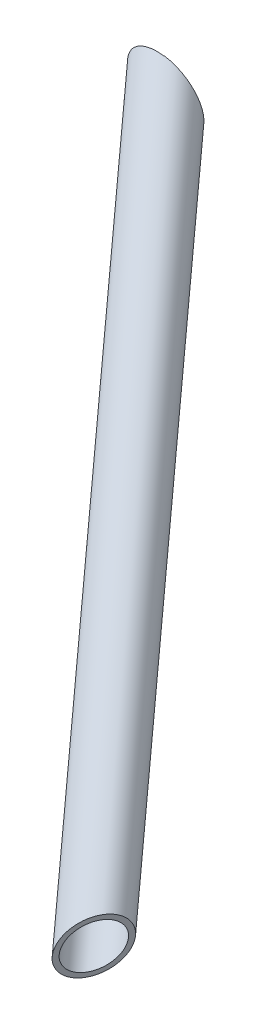
ISO-10303-21;
HEADER;
FILE_DESCRIPTION(('STEP AP214'),'2;1');
FILE_NAME('part.step','',(''),(''),'','','');
FILE_SCHEMA(('AUTOMOTIVE_DESIGN { 1 0 10303 214 1 1 1 1 }'));
ENDSEC;
DATA;
#1=APPLICATION_CONTEXT('core data for automotive mechanical design processes');
#2=APPLICATION_PROTOCOL_DEFINITION('international standard','automotive_design',2000,#1);
#3=PRODUCT_CONTEXT('',#1,'mechanical');
#4=PRODUCT('Part','Part','',(#3));
#5=PRODUCT_RELATED_PRODUCT_CATEGORY('part','',(#4));
#6=PRODUCT_DEFINITION_FORMATION('','',#4);
#7=PRODUCT_DEFINITION_CONTEXT('part definition',#1,'design');
#8=PRODUCT_DEFINITION('design','',#6,#7);
#9=PRODUCT_DEFINITION_SHAPE('','',#8);
#10=(LENGTH_UNIT() NAMED_UNIT(*) SI_UNIT(.MILLI.,.METRE.));
#11=(NAMED_UNIT(*) PLANE_ANGLE_UNIT() SI_UNIT($,.RADIAN.));
#12=(NAMED_UNIT(*) SI_UNIT($,.STERADIAN.) SOLID_ANGLE_UNIT());
#13=UNCERTAINTY_MEASURE_WITH_UNIT(LENGTH_MEASURE(1.E-05),#10,'distance_accuracy_value','');
#14=(GEOMETRIC_REPRESENTATION_CONTEXT(3) GLOBAL_UNCERTAINTY_ASSIGNED_CONTEXT((#13)) GLOBAL_UNIT_ASSIGNED_CONTEXT((#10,
#11,#12)) REPRESENTATION_CONTEXT('',''));
#15=CARTESIAN_POINT('',(0.,0.,0.));
#16=DIRECTION('',(0.,0.,1.));
#17=DIRECTION('',(1.,0.,0.));
#18=AXIS2_PLACEMENT_3D('',#15,#16,#17);
#19=CARTESIAN_POINT('',(-225.,200.,-200.));
#20=DIRECTION('',(0.636784790371592,-0.254713916148637,0.727754046138963));
#21=DIRECTION('',(0.752576694706878,0.,-0.658504607868518));
#22=AXIS2_PLACEMENT_3D('',#19,#20,#21);
#23=CYLINDRICAL_SURFACE('',#22,7.9);
#24=CARTESIAN_POINT('',(-212.607403081643,195.042961232657,-185.837032093306));
#25=DIRECTION('',(-0.936285084522112,-0.351106906695792,-0.00970466753338269));
#26=DIRECTION('',(0.181471265379071,-0.507210243684345,0.842499821093979));
#27=AXIS2_PLACEMENT_3D('',#24,#25,#26);
#28=ELLIPSE('',#27,15.3743489378713,7.9);
#29=CARTESIAN_POINT('',(-216.16230767722,204.63510274096,-189.903424238614));
#30=VERTEX_POINT('',#29);
#31=CARTESIAN_POINT('',(-216.168817710753,204.655132204404,-190.));
#32=VERTEX_POINT('',#31);
#33=EDGE_CURVE('E140',#30,#32,#28,.T.);
#34=ORIENTED_EDGE('',*,*,#33,.T.);
#35=CARTESIAN_POINT('',(-216.25,196.5,-190.));
#36=DIRECTION('',(0.,0.,-1.));
#37=DIRECTION('',(0.928476690885259,-0.371390676354104,0.));
#38=AXIS2_PLACEMENT_3D('',#35,#36,#37);
#39=ELLIPSE('',#38,10.8553158060924,7.9);
#40=CARTESIAN_POINT('',(-208.021674420814,190.,-190.));
#41=VERTEX_POINT('',#40);
#42=EDGE_CURVE('E137',#32,#41,#39,.T.);
#43=ORIENTED_EDGE('',*,*,#42,.T.);
#44=CARTESIAN_POINT('',(-200.,190.,-171.428571428571));
#45=DIRECTION('',(0.,1.,0.));
#46=DIRECTION('',(0.658504607868518,0.,0.752576694706878));
#47=AXIS2_PLACEMENT_3D('',#44,#45,#46);
#48=ELLIPSE('',#47,31.0151880174069,7.9);
#49=CARTESIAN_POINT('',(-210.653505513102,190.,-191.894594696183));
#50=VERTEX_POINT('',#49);
#51=EDGE_CURVE('E133',#41,#50,#48,.T.);
#52=ORIENTED_EDGE('',*,*,#51,.T.);
#53=CARTESIAN_POINT('',(-210.191356839065,188.712567172548,-189.903424238614));
#54=VERTEX_POINT('',#53);
#55=EDGE_CURVE('E136',#50,#54,#28,.T.);
#56=ORIENTED_EDGE('',*,*,#55,.T.);
#57=CARTESIAN_POINT('',(-216.19004498187,196.476017992748,-189.93147997928));
#58=DIRECTION('',(0.00908676337012188,0.0034075362637957,-0.999952908605234));
#59=DIRECTION('',(0.930970716300707,-0.365022539584079,0.0072160228753837));
#60=AXIS2_PLACEMENT_3D('',#57,#58,#59);
#61=ELLIPSE('',#60,10.9296964524874,7.9);
#62=CARTESIAN_POINT('',(-221.406204072577,190.278346413284,-190.));
#63=VERTEX_POINT('',#62);
#64=EDGE_CURVE('E132',#54,#63,#61,.T.);
#65=ORIENTED_EDGE('',*,*,#64,.T.);
#66=CARTESIAN_POINT('',(-216.25,196.5,-190.));
#67=DIRECTION('',(0.,0.,-1.));
#68=DIRECTION('',(0.928476690885259,-0.371390676354104,0.));
#69=AXIS2_PLACEMENT_3D('',#66,#67,#68);
#70=ELLIPSE('',#69,10.8553158060924,7.9);
#71=CARTESIAN_POINT('',(-225.692114200645,201.707440088132,-190.));
#72=VERTEX_POINT('',#71);
#73=EDGE_CURVE('E59',#63,#72,#70,.T.);
#74=ORIENTED_EDGE('',*,*,#73,.T.);
#75=EDGE_CURVE('E131',#72,#30,#61,.T.);
#76=ORIENTED_EDGE('',*,*,#75,.T.);
#77=EDGE_LOOP('',(#34,#43,#52,#56,#65,#74,#76));
#78=FACE_BOUND('',#77,.T.);
#79=CARTESIAN_POINT('',(-50.,130.,0.));
#80=DIRECTION('',(0.904650427063292,-0.140780299510551,0.402229427173004));
#81=DIRECTION('',(-0.426154437750217,-0.298851652810821,0.853861865173774));
#82=AXIS2_PLACEMENT_3D('',#79,#80,#81);
#83=ELLIPSE('',#82,8.73265491693324,7.9);
#84=CARTESIAN_POINT('',(-53.7214596461923,127.390231644648,7.4564810152916));
#85=VERTEX_POINT('',#84);
#86=EDGE_CURVE('E45',#85,#85,#83,.T.);
#87=ORIENTED_EDGE('',*,*,#86,.T.);
#88=EDGE_LOOP('',(#87));
#89=FACE_BOUND('',#88,.T.);
#90=ADVANCED_FACE('F41',(#78,#89),#23,.F.);
#91=CARTESIAN_POINT('',(-225.,200.,-200.));
#92=DIRECTION('',(0.636784790371592,-0.254713916148637,0.727754046138963));
#93=DIRECTION('',(0.752576694706878,0.,-0.658504607868518));
#94=AXIS2_PLACEMENT_3D('',#91,#92,#93);
#95=CYLINDRICAL_SURFACE('',#94,9.5);
#96=CARTESIAN_POINT('',(-216.25,196.5,-190.));
#97=DIRECTION('',(0.,0.,-1.));
#98=DIRECTION('',(0.928476690885259,-0.371390676354104,0.));
#99=AXIS2_PLACEMENT_3D('',#96,#97,#98);
#100=ELLIPSE('',#99,13.0538607794782,9.5);
#101=CARTESIAN_POINT('',(-216.828407616067,206.414038618576,-190.));
#102=VERTEX_POINT('',#101);
#103=CARTESIAN_POINT('',(-205.069430309634,190.,-190.));
#104=VERTEX_POINT('',#103);
#105=EDGE_CURVE('E129',#102,#104,#100,.T.);
#106=ORIENTED_EDGE('',*,*,#105,.F.);
#107=CARTESIAN_POINT('',(-212.607403081643,195.042961232657,-185.837032093306));
#108=DIRECTION('',(-0.936285084522112,-0.351106906695792,-0.00970466753338269));
#109=DIRECTION('',(0.181471265379071,-0.507210243684345,0.842499821093979));
#110=AXIS2_PLACEMENT_3D('',#107,#108,#109);
#111=ELLIPSE('',#110,18.4881411278199,9.5);
#112=CARTESIAN_POINT('',(-216.820628191746,206.390624113029,-189.903424238614));
#113=VERTEX_POINT('',#112);
#114=EDGE_CURVE('E154',#113,#102,#111,.T.);
#115=ORIENTED_EDGE('',*,*,#114,.F.);
#116=CARTESIAN_POINT('',(-216.19004498187,196.476017992748,-189.93147997928));
#117=DIRECTION('',(0.00908676337012188,0.0034075362637957,-0.999952908605234));
#118=DIRECTION('',(0.930970716300707,-0.365022539584079,0.0072160228753837));
#119=AXIS2_PLACEMENT_3D('',#116,#117,#118);
#120=ELLIPSE('',#119,13.1433058605861,9.5);
#121=CARTESIAN_POINT('',(-226.541890620439,203.973510540917,-190.));
#122=VERTEX_POINT('',#121);
#123=EDGE_CURVE('E148',#122,#113,#120,.T.);
#124=ORIENTED_EDGE('',*,*,#123,.F.);
#125=CARTESIAN_POINT('',(-216.25,196.5,-190.));
#126=DIRECTION('',(0.,0.,-1.));
#127=DIRECTION('',(0.928476690885259,-0.371390676354104,0.));
#128=AXIS2_PLACEMENT_3D('',#125,#126,#127);
#129=ELLIPSE('',#128,13.0538607794782,9.5);
#130=CARTESIAN_POINT('',(-223.88379908903,190.,-190.));
#131=VERTEX_POINT('',#130);
#132=EDGE_CURVE('E118',#131,#122,#129,.T.);
#133=ORIENTED_EDGE('',*,*,#132,.F.);
#134=CARTESIAN_POINT('',(-200.,190.,-171.428571428571));
#135=DIRECTION('',(0.,1.,0.));
#136=DIRECTION('',(0.658504607868518,0.,0.752576694706878));
#137=AXIS2_PLACEMENT_3D('',#134,#135,#136);
#138=ELLIPSE('',#137,37.2967450842235,9.5);
#139=CARTESIAN_POINT('',(-223.893613773629,190.,-190.023552087956));
#140=VERTEX_POINT('',#139);
#141=EDGE_CURVE('E110',#140,#131,#138,.T.);
#142=ORIENTED_EDGE('',*,*,#141,.F.);
#143=CARTESIAN_POINT('',(-209.533036324539,186.957045800479,-189.903424238614));
#144=VERTEX_POINT('',#143);
#145=EDGE_CURVE('E123',#144,#140,#120,.T.);
#146=ORIENTED_EDGE('',*,*,#145,.F.);
#147=CARTESIAN_POINT('',(-210.626522375286,190.,-194.49786877884));
#148=VERTEX_POINT('',#147);
#149=EDGE_CURVE('E151',#148,#144,#111,.T.);
#150=ORIENTED_EDGE('',*,*,#149,.F.);
#151=CARTESIAN_POINT('',(-200.,190.,-171.428571428571));
#152=DIRECTION('',(0.,1.,0.));
#153=DIRECTION('',(0.658504607868518,0.,0.752576694706878));
#154=AXIS2_PLACEMENT_3D('',#151,#152,#153);
#155=ELLIPSE('',#154,37.2967450842235,9.5);
#156=EDGE_CURVE('E128',#104,#148,#155,.T.);
#157=ORIENTED_EDGE('',*,*,#156,.F.);
#158=EDGE_LOOP('',(#106,#115,#124,#133,#142,#146,#150,#157));
#159=FACE_BOUND('',#158,.T.);
#160=CARTESIAN_POINT('',(-50.,130.,0.));
#161=DIRECTION('',(0.904650427063292,-0.140780299510551,0.402229427173004));
#162=DIRECTION('',(-0.426154437750217,-0.298851652810821,0.853861865173774));
#163=AXIS2_PLACEMENT_3D('',#160,#161,#162);
#164=ELLIPSE('',#163,10.5012938874513,9.5);
#165=CARTESIAN_POINT('',(-54.4751729922566,126.861670965083,8.96665438547722));
#166=VERTEX_POINT('',#165);
#167=EDGE_CURVE('E11',#166,#166,#164,.T.);
#168=ORIENTED_EDGE('',*,*,#167,.F.);
#169=EDGE_LOOP('',(#168));
#170=FACE_BOUND('',#169,.T.);
#171=ADVANCED_FACE('F191',(#159,#170),#95,.T.);
#172=CARTESIAN_POINT('',(-215.72801678848,203.47699370432,-189.903424238614));
#173=DIRECTION('',(0.00908676337012188,0.0034075362637957,-0.999952908605234));
#174=DIRECTION('',(-0.999958714034088,0.,-0.00908681612516445));
#175=AXIS2_PLACEMENT_3D('',#172,#173,#174);
#176=PLANE('',#175);
#177=DIRECTION('',(0.351123441588392,-0.936329177569044,0.));
#178=VECTOR('',#177,1.);
#179=CARTESIAN_POINT('',(-215.72801678848,203.47699370432,-189.903424238614));
#180=LINE('',#179,#178);
#181=EDGE_CURVE('E162',#54,#144,#180,.T.);
#182=ORIENTED_EDGE('',*,*,#181,.T.);
#183=ORIENTED_EDGE('',*,*,#145,.T.);
#184=DIRECTION('',(-0.999958714034088,0.,-0.00908681612516445));
#185=VECTOR('',#184,1.);
#186=CARTESIAN_POINT('',(-224.999694640781,190.,-190.033603256388));
#187=LINE('',#186,#185);
#188=CARTESIAN_POINT('',(-221.301824167596,190.,-190.));
#189=VERTEX_POINT('',#188);
#190=EDGE_CURVE('E108',#189,#140,#187,.T.);
#191=ORIENTED_EDGE('',*,*,#190,.F.);
#192=DIRECTION('',(0.351123441588392,-0.936329177569045,0.));
#193=VECTOR('',#192,1.);
#194=CARTESIAN_POINT('',(-221.757763653782,191.215838629832,-190.));
#195=LINE('',#194,#193);
#196=EDGE_CURVE('E114',#63,#189,#195,.T.);
#197=ORIENTED_EDGE('',*,*,#196,.F.);
#198=ORIENTED_EDGE('',*,*,#64,.F.);
#199=EDGE_LOOP('',(#182,#183,#191,#197,#198));
#200=FACE_BOUND('',#199,.T.);
#201=ADVANCED_FACE('F121',(#200),#176,.T.);
#202=EDGE_CURVE('E51',#122,#72,#195,.T.);
#203=ORIENTED_EDGE('',*,*,#202,.F.);
#204=ORIENTED_EDGE('',*,*,#123,.T.);
#205=EDGE_CURVE('E150',#113,#30,#180,.T.);
#206=ORIENTED_EDGE('',*,*,#205,.T.);
#207=ORIENTED_EDGE('',*,*,#75,.F.);
#208=EDGE_LOOP('',(#203,#204,#206,#207));
#209=FACE_BOUND('',#208,.T.);
#210=ADVANCED_FACE('F197',(#209),#176,.T.);
#211=CARTESIAN_POINT('',(-215.72801678848,203.47699370432,-189.903424238614));
#212=DIRECTION('',(-0.936285084522112,-0.351106906695792,-0.00970466753338269));
#213=DIRECTION('',(0.351123441588392,-0.936329177569045,0.));
#214=AXIS2_PLACEMENT_3D('',#211,#212,#213);
#215=PLANE('',#214);
#216=ORIENTED_EDGE('',*,*,#205,.F.);
#217=ORIENTED_EDGE('',*,*,#114,.T.);
#218=DIRECTION('',(-0.351123441588392,0.936329177569045,0.));
#219=VECTOR('',#218,1.);
#220=CARTESIAN_POINT('',(-212.439467953185,194.710199517556,-190.));
#221=LINE('',#220,#219);
#222=EDGE_CURVE('E153',#32,#102,#221,.T.);
#223=ORIENTED_EDGE('',*,*,#222,.F.);
#224=ORIENTED_EDGE('',*,*,#33,.F.);
#225=EDGE_LOOP('',(#216,#217,#223,#224));
#226=FACE_BOUND('',#225,.T.);
#227=ADVANCED_FACE('F176',(#226),#215,.T.);
#228=DIRECTION('',(-0.010364520834665,0.,0.999946286911386));
#229=VECTOR('',#228,1.);
#230=CARTESIAN_POINT('',(-210.674682172232,190.,-189.851516969429));
#231=LINE('',#230,#229);
#232=EDGE_CURVE('E147',#148,#50,#231,.T.);
#233=ORIENTED_EDGE('',*,*,#232,.F.);
#234=ORIENTED_EDGE('',*,*,#149,.T.);
#235=ORIENTED_EDGE('',*,*,#181,.F.);
#236=ORIENTED_EDGE('',*,*,#55,.F.);
#237=EDGE_LOOP('',(#233,#234,#235,#236));
#238=FACE_BOUND('',#237,.T.);
#239=ADVANCED_FACE('F204',(#238),#215,.T.);
#240=CARTESIAN_POINT('',(-225.,190.,-190.));
#241=DIRECTION('',(0.,0.,-1.));
#242=DIRECTION('',(-1.,0.,0.));
#243=AXIS2_PLACEMENT_3D('',#240,#241,#242);
#244=PLANE('',#243);
#245=ORIENTED_EDGE('',*,*,#222,.T.);
#246=ORIENTED_EDGE('',*,*,#105,.T.);
#247=DIRECTION('',(1.,0.,0.));
#248=VECTOR('',#247,1.);
#249=CARTESIAN_POINT('',(-225.,190.,-190.));
#250=LINE('',#249,#248);
#251=EDGE_CURVE('E113',#41,#104,#250,.T.);
#252=ORIENTED_EDGE('',*,*,#251,.F.);
#253=ORIENTED_EDGE('',*,*,#42,.F.);
#254=EDGE_LOOP('',(#245,#246,#252,#253));
#255=FACE_BOUND('',#254,.T.);
#256=ADVANCED_FACE('F173',(#255),#244,.T.);
#257=CARTESIAN_POINT('',(-225.,190.,-190.));
#258=DIRECTION('',(0.,1.,0.));
#259=DIRECTION('',(0.,0.,1.));
#260=AXIS2_PLACEMENT_3D('',#257,#258,#259);
#261=PLANE('',#260);
#262=ORIENTED_EDGE('',*,*,#251,.T.);
#263=ORIENTED_EDGE('',*,*,#156,.T.);
#264=ORIENTED_EDGE('',*,*,#232,.T.);
#265=ORIENTED_EDGE('',*,*,#51,.F.);
#266=EDGE_LOOP('',(#262,#263,#264,#265));
#267=FACE_BOUND('',#266,.T.);
#268=ADVANCED_FACE('F166',(#267),#261,.T.);
#269=ORIENTED_EDGE('',*,*,#141,.T.);
#270=EDGE_CURVE('E102',#131,#189,#250,.T.);
#271=ORIENTED_EDGE('',*,*,#270,.T.);
#272=ORIENTED_EDGE('',*,*,#190,.T.);
#273=EDGE_LOOP('',(#269,#271,#272));
#274=FACE_BOUND('',#273,.T.);
#275=ADVANCED_FACE('F106',(#274),#261,.T.);
#276=ORIENTED_EDGE('',*,*,#196,.T.);
#277=ORIENTED_EDGE('',*,*,#270,.F.);
#278=ORIENTED_EDGE('',*,*,#132,.T.);
#279=ORIENTED_EDGE('',*,*,#202,.T.);
#280=ORIENTED_EDGE('',*,*,#73,.F.);
#281=EDGE_LOOP('',(#276,#277,#278,#279,#280));
#282=FACE_BOUND('',#281,.T.);
#283=ADVANCED_FACE('F115',(#282),#244,.T.);
#284=CARTESIAN_POINT('',(-50.,130.,0.));
#285=DIRECTION('',(0.904650427063292,-0.140780299510551,0.402229427173004));
#286=DIRECTION('',(0.406275581998161,0.,-0.913750595880547));
#287=AXIS2_PLACEMENT_3D('',#284,#285,#286);
#288=PLANE('',#287);
#289=ORIENTED_EDGE('',*,*,#86,.F.);
#290=EDGE_LOOP('',(#289));
#291=FACE_BOUND('',#290,.T.);
#292=ORIENTED_EDGE('',*,*,#167,.T.);
#293=EDGE_LOOP('',(#292));
#294=FACE_BOUND('',#293,.T.);
#295=ADVANCED_FACE('F43',(#291,#294),#288,.T.);
#296=CLOSED_SHELL('',(#90,#171,#201,#210,#227,#239,#256,#268,#275,#283,#295));
#297=MANIFOLD_SOLID_BREP('B2',#296);
#298=ADVANCED_BREP_SHAPE_REPRESENTATION('',(#18,#297),#14);
#299=SHAPE_DEFINITION_REPRESENTATION(#9,#298);
ENDSEC;
END-ISO-10303-21;
